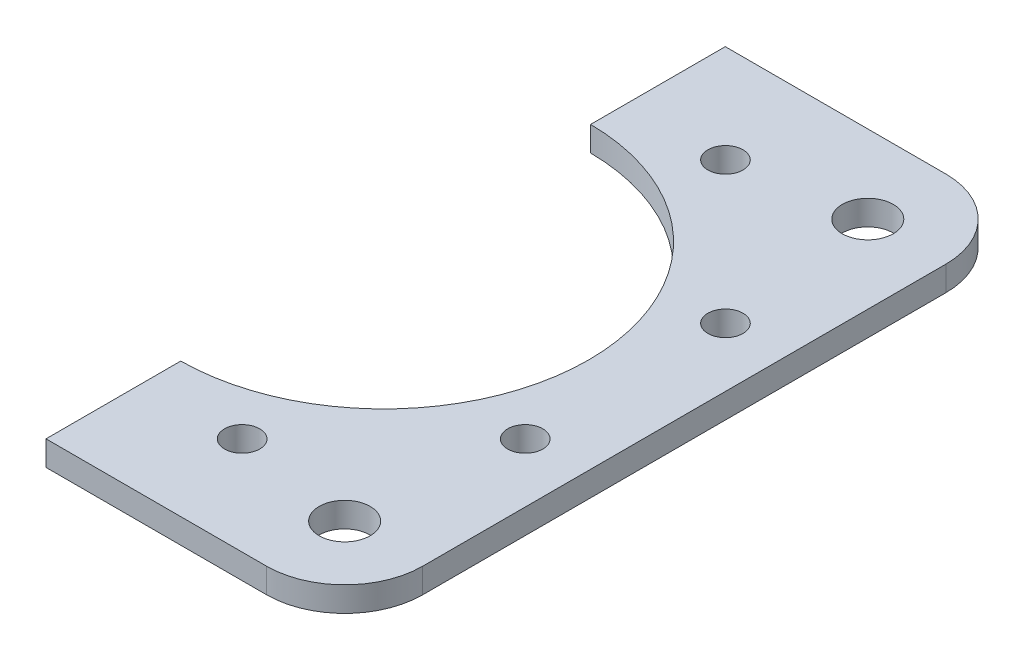
ISO-10303-21;
HEADER;
FILE_DESCRIPTION(('STEP AP214'),'2;1');
FILE_NAME('part.step','',(''),(''),'','','');
FILE_SCHEMA(('AUTOMOTIVE_DESIGN { 1 0 10303 214 1 1 1 1 }'));
ENDSEC;
DATA;
#1=APPLICATION_CONTEXT('core data for automotive mechanical design processes');
#2=APPLICATION_PROTOCOL_DEFINITION('international standard','automotive_design',2000,#1);
#3=PRODUCT_CONTEXT('',#1,'mechanical');
#4=PRODUCT('Part','Part','',(#3));
#5=PRODUCT_RELATED_PRODUCT_CATEGORY('part','',(#4));
#6=PRODUCT_DEFINITION_FORMATION('','',#4);
#7=PRODUCT_DEFINITION_CONTEXT('part definition',#1,'design');
#8=PRODUCT_DEFINITION('design','',#6,#7);
#9=PRODUCT_DEFINITION_SHAPE('','',#8);
#10=(LENGTH_UNIT() NAMED_UNIT(*) SI_UNIT(.MILLI.,.METRE.));
#11=(NAMED_UNIT(*) PLANE_ANGLE_UNIT() SI_UNIT($,.RADIAN.));
#12=(NAMED_UNIT(*) SI_UNIT($,.STERADIAN.) SOLID_ANGLE_UNIT());
#13=UNCERTAINTY_MEASURE_WITH_UNIT(LENGTH_MEASURE(1.E-05),#10,'distance_accuracy_value','');
#14=(GEOMETRIC_REPRESENTATION_CONTEXT(3) GLOBAL_UNCERTAINTY_ASSIGNED_CONTEXT((#13)) GLOBAL_UNIT_ASSIGNED_CONTEXT((#10,
#11,#12)) REPRESENTATION_CONTEXT('',''));
#15=CARTESIAN_POINT('',(0.,0.,0.));
#16=DIRECTION('',(0.,0.,1.));
#17=DIRECTION('',(1.,0.,0.));
#18=AXIS2_PLACEMENT_3D('',#15,#16,#17);
#19=CARTESIAN_POINT('',(0.,84.005,0.));
#20=DIRECTION('',(0.,1.,0.));
#21=DIRECTION('',(0.,0.,1.));
#22=AXIS2_PLACEMENT_3D('',#19,#20,#21);
#23=CYLINDRICAL_SURFACE('',#22,26.25);
#24=CARTESIAN_POINT('',(0.,87.18,0.));
#25=DIRECTION('',(0.,1.,0.));
#26=DIRECTION('',(0.,0.,1.));
#27=AXIS2_PLACEMENT_3D('',#24,#25,#26);
#28=CIRCLE('',#27,26.25);
#29=CARTESIAN_POINT('',(0.250000000000008,87.18,26.2488094968134));
#30=VERTEX_POINT('',#29);
#31=CARTESIAN_POINT('',(0.250000000000008,87.18,-26.2488094968134));
#32=VERTEX_POINT('',#31);
#33=EDGE_CURVE('E154',#30,#32,#28,.T.);
#34=ORIENTED_EDGE('',*,*,#33,.T.);
#35=DIRECTION('',(0.,1.,0.));
#36=VECTOR('',#35,1.);
#37=CARTESIAN_POINT('',(0.250000000000008,84.005,-26.2488094968134));
#38=LINE('',#37,#36);
#39=CARTESIAN_POINT('',(0.250000000000008,84.005,-26.2488094968134));
#40=VERTEX_POINT('',#39);
#41=EDGE_CURVE('E11',#40,#32,#38,.T.);
#42=ORIENTED_EDGE('',*,*,#41,.F.);
#43=CARTESIAN_POINT('',(0.,84.005,0.));
#44=DIRECTION('',(0.,1.,0.));
#45=DIRECTION('',(0.,0.,1.));
#46=AXIS2_PLACEMENT_3D('',#43,#44,#45);
#47=CIRCLE('',#46,26.25);
#48=CARTESIAN_POINT('',(0.250000000000008,84.005,26.2488094968134));
#49=VERTEX_POINT('',#48);
#50=EDGE_CURVE('E57',#49,#40,#47,.T.);
#51=ORIENTED_EDGE('',*,*,#50,.F.);
#52=DIRECTION('',(0.,1.,0.));
#53=VECTOR('',#52,1.);
#54=CARTESIAN_POINT('',(0.250000000000008,84.005,26.2488094968134));
#55=LINE('',#54,#53);
#56=EDGE_CURVE('E42',#49,#30,#55,.T.);
#57=ORIENTED_EDGE('',*,*,#56,.T.);
#58=EDGE_LOOP('',(#34,#42,#51,#57));
#59=FACE_BOUND('',#58,.T.);
#60=ADVANCED_FACE('F39',(#59),#23,.F.);
#61=CARTESIAN_POINT('',(0.250000000000008,84.005,0.));
#62=DIRECTION('',(-1.,0.,0.));
#63=DIRECTION('',(0.,0.,1.));
#64=AXIS2_PLACEMENT_3D('',#61,#62,#63);
#65=PLANE('',#64);
#66=DIRECTION('',(0.,0.,1.));
#67=VECTOR('',#66,1.);
#68=CARTESIAN_POINT('',(0.250000000000008,87.18,0.));
#69=LINE('',#68,#67);
#70=CARTESIAN_POINT('',(0.250000000000008,87.18,-43.4991883031318));
#71=VERTEX_POINT('',#70);
#72=EDGE_CURVE('E170',#71,#32,#69,.T.);
#73=ORIENTED_EDGE('',*,*,#72,.F.);
#74=DIRECTION('',(0.,1.,0.));
#75=VECTOR('',#74,1.);
#76=CARTESIAN_POINT('',(0.250000000000008,84.005,-43.4991883031318));
#77=LINE('',#76,#75);
#78=CARTESIAN_POINT('',(0.250000000000008,84.005,-43.4991883031318));
#79=VERTEX_POINT('',#78);
#80=EDGE_CURVE('E48',#79,#71,#77,.T.);
#81=ORIENTED_EDGE('',*,*,#80,.F.);
#82=DIRECTION('',(0.,0.,1.));
#83=VECTOR('',#82,1.);
#84=CARTESIAN_POINT('',(0.250000000000008,84.005,0.));
#85=LINE('',#84,#83);
#86=EDGE_CURVE('E116',#79,#40,#85,.T.);
#87=ORIENTED_EDGE('',*,*,#86,.T.);
#88=ORIENTED_EDGE('',*,*,#41,.T.);
#89=EDGE_LOOP('',(#73,#81,#87,#88));
#90=FACE_BOUND('',#89,.T.);
#91=ADVANCED_FACE('F206',(#90),#65,.T.);
#92=CARTESIAN_POINT('',(0.,84.005,-43.4991883031318));
#93=DIRECTION('',(0.,0.,1.));
#94=DIRECTION('',(1.,0.,0.));
#95=AXIS2_PLACEMENT_3D('',#92,#93,#94);
#96=PLANE('',#95);
#97=DIRECTION('',(1.,0.,0.));
#98=VECTOR('',#97,1.);
#99=CARTESIAN_POINT('',(0.,87.18,-43.4991883031318));
#100=LINE('',#99,#98);
#101=CARTESIAN_POINT('',(28.4999999999999,87.18,-43.4991883031318));
#102=VERTEX_POINT('',#101);
#103=EDGE_CURVE('E121',#71,#102,#100,.T.);
#104=ORIENTED_EDGE('',*,*,#103,.T.);
#105=DIRECTION('',(0.,1.,0.));
#106=VECTOR('',#105,1.);
#107=CARTESIAN_POINT('',(28.4999999999999,84.005,-43.4991883031318));
#108=LINE('',#107,#106);
#109=CARTESIAN_POINT('',(28.4999999999999,84.005,-43.4991883031318));
#110=VERTEX_POINT('',#109);
#111=EDGE_CURVE('E119',#110,#102,#108,.T.);
#112=ORIENTED_EDGE('',*,*,#111,.F.);
#113=DIRECTION('',(1.,0.,0.));
#114=VECTOR('',#113,1.);
#115=CARTESIAN_POINT('',(0.,84.005,-43.4991883031318));
#116=LINE('',#115,#114);
#117=EDGE_CURVE('E109',#79,#110,#116,.T.);
#118=ORIENTED_EDGE('',*,*,#117,.F.);
#119=ORIENTED_EDGE('',*,*,#80,.T.);
#120=EDGE_LOOP('',(#104,#112,#118,#119));
#121=FACE_BOUND('',#120,.T.);
#122=ADVANCED_FACE('F120',(#121),#96,.F.);
#123=CARTESIAN_POINT('',(28.5,84.005,-33.4991883031318));
#124=DIRECTION('',(0.,1.,0.));
#125=DIRECTION('',(0.,0.,1.));
#126=AXIS2_PLACEMENT_3D('',#123,#124,#125);
#127=CYLINDRICAL_SURFACE('',#126,10.);
#128=CARTESIAN_POINT('',(28.5,87.18,-33.4991883031318));
#129=DIRECTION('',(0.,1.,0.));
#130=DIRECTION('',(0.,0.,1.));
#131=AXIS2_PLACEMENT_3D('',#128,#129,#130);
#132=CIRCLE('',#131,10.);
#133=CARTESIAN_POINT('',(38.5,87.18,-33.4991883031317));
#134=VERTEX_POINT('',#133);
#135=EDGE_CURVE('E167',#102,#134,#132,.F.);
#136=ORIENTED_EDGE('',*,*,#135,.T.);
#137=DIRECTION('',(0.,1.,0.));
#138=VECTOR('',#137,1.);
#139=CARTESIAN_POINT('',(38.5,84.005,-33.4991883031317));
#140=LINE('',#139,#138);
#141=CARTESIAN_POINT('',(38.5,84.005,-33.4991883031317));
#142=VERTEX_POINT('',#141);
#143=EDGE_CURVE('E124',#142,#134,#140,.T.);
#144=ORIENTED_EDGE('',*,*,#143,.F.);
#145=CARTESIAN_POINT('',(28.5,84.005,-33.4991883031318));
#146=DIRECTION('',(0.,1.,0.));
#147=DIRECTION('',(0.,0.,1.));
#148=AXIS2_PLACEMENT_3D('',#145,#146,#147);
#149=CIRCLE('',#148,10.);
#150=EDGE_CURVE('E114',#110,#142,#149,.F.);
#151=ORIENTED_EDGE('',*,*,#150,.F.);
#152=ORIENTED_EDGE('',*,*,#111,.T.);
#153=EDGE_LOOP('',(#136,#144,#151,#152));
#154=FACE_BOUND('',#153,.T.);
#155=ADVANCED_FACE('F126',(#154),#127,.T.);
#156=CARTESIAN_POINT('',(38.5,84.005,0.));
#157=DIRECTION('',(-1.,0.,0.));
#158=DIRECTION('',(0.,0.,1.));
#159=AXIS2_PLACEMENT_3D('',#156,#157,#158);
#160=PLANE('',#159);
#161=DIRECTION('',(0.,0.,1.));
#162=VECTOR('',#161,1.);
#163=CARTESIAN_POINT('',(38.5,87.18,0.));
#164=LINE('',#163,#162);
#165=CARTESIAN_POINT('',(38.5,87.18,33.4991883031317));
#166=VERTEX_POINT('',#165);
#167=EDGE_CURVE('E164',#134,#166,#164,.T.);
#168=ORIENTED_EDGE('',*,*,#167,.T.);
#169=DIRECTION('',(0.,1.,0.));
#170=VECTOR('',#169,1.);
#171=CARTESIAN_POINT('',(38.5,84.005,33.4991883031317));
#172=LINE('',#171,#170);
#173=CARTESIAN_POINT('',(38.5,84.005,33.4991883031317));
#174=VERTEX_POINT('',#173);
#175=EDGE_CURVE('E193',#174,#166,#172,.T.);
#176=ORIENTED_EDGE('',*,*,#175,.F.);
#177=DIRECTION('',(0.,0.,1.));
#178=VECTOR('',#177,1.);
#179=CARTESIAN_POINT('',(38.5,84.005,0.));
#180=LINE('',#179,#178);
#181=EDGE_CURVE('E129',#142,#174,#180,.T.);
#182=ORIENTED_EDGE('',*,*,#181,.F.);
#183=ORIENTED_EDGE('',*,*,#143,.T.);
#184=EDGE_LOOP('',(#168,#176,#182,#183));
#185=FACE_BOUND('',#184,.T.);
#186=ADVANCED_FACE('F220',(#185),#160,.F.);
#187=CARTESIAN_POINT('',(28.5,84.005,33.4991883031318));
#188=DIRECTION('',(0.,1.,0.));
#189=DIRECTION('',(0.,0.,1.));
#190=AXIS2_PLACEMENT_3D('',#187,#188,#189);
#191=CYLINDRICAL_SURFACE('',#190,10.);
#192=CARTESIAN_POINT('',(28.5,87.18,33.4991883031318));
#193=DIRECTION('',(0.,1.,0.));
#194=DIRECTION('',(0.,0.,1.));
#195=AXIS2_PLACEMENT_3D('',#192,#193,#194);
#196=CIRCLE('',#195,10.);
#197=CARTESIAN_POINT('',(28.4999999999999,87.18,43.4991883031318));
#198=VERTEX_POINT('',#197);
#199=EDGE_CURVE('E161',#198,#166,#196,.T.);
#200=ORIENTED_EDGE('',*,*,#199,.F.);
#201=DIRECTION('',(0.,1.,0.));
#202=VECTOR('',#201,1.);
#203=CARTESIAN_POINT('',(28.4999999999999,84.005,43.4991883031318));
#204=LINE('',#203,#202);
#205=CARTESIAN_POINT('',(28.4999999999999,84.005,43.4991883031318));
#206=VERTEX_POINT('',#205);
#207=EDGE_CURVE('E195',#206,#198,#204,.T.);
#208=ORIENTED_EDGE('',*,*,#207,.F.);
#209=CARTESIAN_POINT('',(28.5,84.005,33.4991883031318));
#210=DIRECTION('',(0.,1.,0.));
#211=DIRECTION('',(0.,0.,1.));
#212=AXIS2_PLACEMENT_3D('',#209,#210,#211);
#213=CIRCLE('',#212,10.);
#214=EDGE_CURVE('E131',#206,#174,#213,.T.);
#215=ORIENTED_EDGE('',*,*,#214,.T.);
#216=ORIENTED_EDGE('',*,*,#175,.T.);
#217=EDGE_LOOP('',(#200,#208,#215,#216));
#218=FACE_BOUND('',#217,.T.);
#219=ADVANCED_FACE('F223',(#218),#191,.T.);
#220=CARTESIAN_POINT('',(0.,84.005,43.4991883031318));
#221=DIRECTION('',(0.,0.,1.));
#222=DIRECTION('',(1.,0.,0.));
#223=AXIS2_PLACEMENT_3D('',#220,#221,#222);
#224=PLANE('',#223);
#225=DIRECTION('',(1.,0.,0.));
#226=VECTOR('',#225,1.);
#227=CARTESIAN_POINT('',(0.,87.18,43.4991883031318));
#228=LINE('',#227,#226);
#229=CARTESIAN_POINT('',(0.250000000000008,87.18,43.4991883031318));
#230=VERTEX_POINT('',#229);
#231=EDGE_CURVE('E158',#230,#198,#228,.T.);
#232=ORIENTED_EDGE('',*,*,#231,.F.);
#233=DIRECTION('',(0.,1.,0.));
#234=VECTOR('',#233,1.);
#235=CARTESIAN_POINT('',(0.250000000000008,84.005,43.4991883031318));
#236=LINE('',#235,#234);
#237=CARTESIAN_POINT('',(0.250000000000008,84.005,43.4991883031318));
#238=VERTEX_POINT('',#237);
#239=EDGE_CURVE('E196',#238,#230,#236,.T.);
#240=ORIENTED_EDGE('',*,*,#239,.F.);
#241=DIRECTION('',(1.,0.,0.));
#242=VECTOR('',#241,1.);
#243=CARTESIAN_POINT('',(0.,84.005,43.4991883031318));
#244=LINE('',#243,#242);
#245=EDGE_CURVE('E436',#238,#206,#244,.T.);
#246=ORIENTED_EDGE('',*,*,#245,.T.);
#247=ORIENTED_EDGE('',*,*,#207,.T.);
#248=EDGE_LOOP('',(#232,#240,#246,#247));
#249=FACE_BOUND('',#248,.T.);
#250=ADVANCED_FACE('F227',(#249),#224,.T.);
#251=CARTESIAN_POINT('',(28.5,84.005,-33.4991883031318));
#252=DIRECTION('',(0.,1.,0.));
#253=DIRECTION('',(0.,0.,1.));
#254=AXIS2_PLACEMENT_3D('',#251,#252,#253);
#255=CYLINDRICAL_SURFACE('',#254,3.26390000000001);
#256=CARTESIAN_POINT('',(28.5,84.005,-33.4991883031318));
#257=DIRECTION('',(0.,1.,0.));
#258=DIRECTION('',(0.,0.,1.));
#259=AXIS2_PLACEMENT_3D('',#256,#257,#258);
#260=CIRCLE('',#259,3.26390000000001);
#261=CARTESIAN_POINT('',(28.5,84.005,-30.2352883031318));
#262=VERTEX_POINT('',#261);
#263=EDGE_CURVE('E148',#262,#262,#260,.T.);
#264=ORIENTED_EDGE('',*,*,#263,.F.);
#265=EDGE_LOOP('',(#264));
#266=FACE_BOUND('',#265,.T.);
#267=CARTESIAN_POINT('',(28.5,87.18,-33.4991883031318));
#268=DIRECTION('',(0.,1.,0.));
#269=DIRECTION('',(0.,0.,1.));
#270=AXIS2_PLACEMENT_3D('',#267,#268,#269);
#271=CIRCLE('',#270,3.26390000000001);
#272=CARTESIAN_POINT('',(28.5,87.18,-30.2352883031318));
#273=VERTEX_POINT('',#272);
#274=EDGE_CURVE('E185',#273,#273,#271,.T.);
#275=ORIENTED_EDGE('',*,*,#274,.T.);
#276=EDGE_LOOP('',(#275));
#277=FACE_BOUND('',#276,.T.);
#278=ADVANCED_FACE('F230',(#266,#277),#255,.F.);
#279=CARTESIAN_POINT('',(12.8198949842307,84.005,30.949964339128));
#280=DIRECTION('',(0.,1.,0.));
#281=DIRECTION('',(0.,0.,1.));
#282=AXIS2_PLACEMENT_3D('',#279,#280,#281);
#283=CYLINDRICAL_SURFACE('',#282,2.25);
#284=CARTESIAN_POINT('',(12.8198949842307,84.005,30.949964339128));
#285=DIRECTION('',(0.,1.,0.));
#286=DIRECTION('',(0.,0.,1.));
#287=AXIS2_PLACEMENT_3D('',#284,#285,#286);
#288=CIRCLE('',#287,2.25);
#289=CARTESIAN_POINT('',(12.8198949842307,84.005,33.199964339128));
#290=VERTEX_POINT('',#289);
#291=EDGE_CURVE('E145',#290,#290,#288,.T.);
#292=ORIENTED_EDGE('',*,*,#291,.F.);
#293=EDGE_LOOP('',(#292));
#294=FACE_BOUND('',#293,.T.);
#295=CARTESIAN_POINT('',(12.8198949842307,87.18,30.949964339128));
#296=DIRECTION('',(0.,1.,0.));
#297=DIRECTION('',(0.,0.,1.));
#298=AXIS2_PLACEMENT_3D('',#295,#296,#297);
#299=CIRCLE('',#298,2.25);
#300=CARTESIAN_POINT('',(12.8198949842307,87.18,33.199964339128));
#301=VERTEX_POINT('',#300);
#302=EDGE_CURVE('E182',#301,#301,#299,.T.);
#303=ORIENTED_EDGE('',*,*,#302,.T.);
#304=EDGE_LOOP('',(#303));
#305=FACE_BOUND('',#304,.T.);
#306=ADVANCED_FACE('F266',(#294,#305),#283,.F.);
#307=CARTESIAN_POINT('',(30.9499643391282,84.005,12.8198949842303));
#308=DIRECTION('',(0.,1.,0.));
#309=DIRECTION('',(0.,0.,1.));
#310=AXIS2_PLACEMENT_3D('',#307,#308,#309);
#311=CYLINDRICAL_SURFACE('',#310,2.25);
#312=CARTESIAN_POINT('',(30.9499643391282,84.005,12.8198949842303));
#313=DIRECTION('',(0.,1.,0.));
#314=DIRECTION('',(0.,0.,1.));
#315=AXIS2_PLACEMENT_3D('',#312,#313,#314);
#316=CIRCLE('',#315,2.25);
#317=CARTESIAN_POINT('',(30.9499643391282,84.005,15.0698949842303));
#318=VERTEX_POINT('',#317);
#319=EDGE_CURVE('E142',#318,#318,#316,.T.);
#320=ORIENTED_EDGE('',*,*,#319,.F.);
#321=EDGE_LOOP('',(#320));
#322=FACE_BOUND('',#321,.T.);
#323=CARTESIAN_POINT('',(30.9499643391282,87.18,12.8198949842303));
#324=DIRECTION('',(0.,1.,0.));
#325=DIRECTION('',(0.,0.,1.));
#326=AXIS2_PLACEMENT_3D('',#323,#324,#325);
#327=CIRCLE('',#326,2.25);
#328=CARTESIAN_POINT('',(30.9499643391282,87.18,15.0698949842303));
#329=VERTEX_POINT('',#328);
#330=EDGE_CURVE('E179',#329,#329,#327,.T.);
#331=ORIENTED_EDGE('',*,*,#330,.T.);
#332=EDGE_LOOP('',(#331));
#333=FACE_BOUND('',#332,.T.);
#334=ADVANCED_FACE('F246',(#322,#333),#311,.F.);
#335=CARTESIAN_POINT('',(30.9499643391281,84.005,-12.8198949842307));
#336=DIRECTION('',(0.,1.,0.));
#337=DIRECTION('',(0.,0.,1.));
#338=AXIS2_PLACEMENT_3D('',#335,#336,#337);
#339=CYLINDRICAL_SURFACE('',#338,2.25);
#340=CARTESIAN_POINT('',(30.9499643391281,84.005,-12.8198949842307));
#341=DIRECTION('',(0.,1.,0.));
#342=DIRECTION('',(0.,0.,1.));
#343=AXIS2_PLACEMENT_3D('',#340,#341,#342);
#344=CIRCLE('',#343,2.25);
#345=CARTESIAN_POINT('',(30.9499643391281,84.005,-10.5698949842307));
#346=VERTEX_POINT('',#345);
#347=EDGE_CURVE('E139',#346,#346,#344,.T.);
#348=ORIENTED_EDGE('',*,*,#347,.F.);
#349=EDGE_LOOP('',(#348));
#350=FACE_BOUND('',#349,.T.);
#351=CARTESIAN_POINT('',(30.9499643391281,87.18,-12.8198949842307));
#352=DIRECTION('',(0.,1.,0.));
#353=DIRECTION('',(0.,0.,1.));
#354=AXIS2_PLACEMENT_3D('',#351,#352,#353);
#355=CIRCLE('',#354,2.25);
#356=CARTESIAN_POINT('',(30.9499643391281,87.18,-10.5698949842307));
#357=VERTEX_POINT('',#356);
#358=EDGE_CURVE('E176',#357,#357,#355,.T.);
#359=ORIENTED_EDGE('',*,*,#358,.T.);
#360=EDGE_LOOP('',(#359));
#361=FACE_BOUND('',#360,.T.);
#362=ADVANCED_FACE('F241',(#350,#361),#339,.F.);
#363=CARTESIAN_POINT('',(12.8198949842303,84.005,-30.9499643391282));
#364=DIRECTION('',(0.,1.,0.));
#365=DIRECTION('',(0.,0.,1.));
#366=AXIS2_PLACEMENT_3D('',#363,#364,#365);
#367=CYLINDRICAL_SURFACE('',#366,2.25);
#368=CARTESIAN_POINT('',(12.8198949842303,84.005,-30.9499643391282));
#369=DIRECTION('',(0.,1.,0.));
#370=DIRECTION('',(0.,0.,1.));
#371=AXIS2_PLACEMENT_3D('',#368,#369,#370);
#372=CIRCLE('',#371,2.25);
#373=CARTESIAN_POINT('',(12.8198949842303,84.005,-28.6999643391282));
#374=VERTEX_POINT('',#373);
#375=EDGE_CURVE('E136',#374,#374,#372,.T.);
#376=ORIENTED_EDGE('',*,*,#375,.F.);
#377=EDGE_LOOP('',(#376));
#378=FACE_BOUND('',#377,.T.);
#379=CARTESIAN_POINT('',(12.8198949842303,87.18,-30.9499643391282));
#380=DIRECTION('',(0.,1.,0.));
#381=DIRECTION('',(0.,0.,1.));
#382=AXIS2_PLACEMENT_3D('',#379,#380,#381);
#383=CIRCLE('',#382,2.25);
#384=CARTESIAN_POINT('',(12.8198949842303,87.18,-28.6999643391282));
#385=VERTEX_POINT('',#384);
#386=EDGE_CURVE('E173',#385,#385,#383,.T.);
#387=ORIENTED_EDGE('',*,*,#386,.T.);
#388=EDGE_LOOP('',(#387));
#389=FACE_BOUND('',#388,.T.);
#390=ADVANCED_FACE('F215',(#378,#389),#367,.F.);
#391=CARTESIAN_POINT('',(0.250000000000008,84.005,0.));
#392=DIRECTION('',(1.,0.,0.));
#393=DIRECTION('',(0.,0.,-1.));
#394=AXIS2_PLACEMENT_3D('',#391,#392,#393);
#395=PLANE('',#394);
#396=DIRECTION('',(0.,0.,-1.));
#397=VECTOR('',#396,1.);
#398=CARTESIAN_POINT('',(0.250000000000008,87.18,0.));
#399=LINE('',#398,#397);
#400=EDGE_CURVE('E156',#230,#30,#399,.T.);
#401=ORIENTED_EDGE('',*,*,#400,.T.);
#402=ORIENTED_EDGE('',*,*,#56,.F.);
#403=DIRECTION('',(0.,0.,-1.));
#404=VECTOR('',#403,1.);
#405=CARTESIAN_POINT('',(0.250000000000008,84.005,0.));
#406=LINE('',#405,#404);
#407=EDGE_CURVE('E95',#238,#49,#406,.T.);
#408=ORIENTED_EDGE('',*,*,#407,.F.);
#409=ORIENTED_EDGE('',*,*,#239,.T.);
#410=EDGE_LOOP('',(#401,#402,#408,#409));
#411=FACE_BOUND('',#410,.T.);
#412=ADVANCED_FACE('F232',(#411),#395,.F.);
#413=CARTESIAN_POINT('',(28.5,84.005,33.4991883031318));
#414=DIRECTION('',(0.,1.,0.));
#415=DIRECTION('',(0.,0.,1.));
#416=AXIS2_PLACEMENT_3D('',#413,#414,#415);
#417=CYLINDRICAL_SURFACE('',#416,3.26390000000001);
#418=CARTESIAN_POINT('',(28.5,84.005,33.4991883031318));
#419=DIRECTION('',(0.,1.,0.));
#420=DIRECTION('',(0.,0.,1.));
#421=AXIS2_PLACEMENT_3D('',#418,#419,#420);
#422=CIRCLE('',#421,3.26390000000001);
#423=CARTESIAN_POINT('',(28.5,84.005,36.7630883031318));
#424=VERTEX_POINT('',#423);
#425=EDGE_CURVE('E151',#424,#424,#422,.T.);
#426=ORIENTED_EDGE('',*,*,#425,.F.);
#427=EDGE_LOOP('',(#426));
#428=FACE_BOUND('',#427,.T.);
#429=CARTESIAN_POINT('',(28.5,87.18,33.4991883031318));
#430=DIRECTION('',(0.,1.,0.));
#431=DIRECTION('',(0.,0.,1.));
#432=AXIS2_PLACEMENT_3D('',#429,#430,#431);
#433=CIRCLE('',#432,3.26390000000001);
#434=CARTESIAN_POINT('',(28.5,87.18,36.7630883031318));
#435=VERTEX_POINT('',#434);
#436=EDGE_CURVE('E188',#435,#435,#433,.T.);
#437=ORIENTED_EDGE('',*,*,#436,.T.);
#438=EDGE_LOOP('',(#437));
#439=FACE_BOUND('',#438,.T.);
#440=ADVANCED_FACE('F234',(#428,#439),#417,.F.);
#441=CARTESIAN_POINT('',(0.,84.005,0.));
#442=DIRECTION('',(0.,1.,0.));
#443=DIRECTION('',(0.,0.,1.));
#444=AXIS2_PLACEMENT_3D('',#441,#442,#443);
#445=PLANE('',#444);
#446=ORIENTED_EDGE('',*,*,#50,.T.);
#447=ORIENTED_EDGE('',*,*,#86,.F.);
#448=ORIENTED_EDGE('',*,*,#117,.T.);
#449=ORIENTED_EDGE('',*,*,#150,.T.);
#450=ORIENTED_EDGE('',*,*,#181,.T.);
#451=ORIENTED_EDGE('',*,*,#214,.F.);
#452=ORIENTED_EDGE('',*,*,#245,.F.);
#453=ORIENTED_EDGE('',*,*,#407,.T.);
#454=EDGE_LOOP('',(#446,#447,#448,#449,#450,#451,#452,#453));
#455=FACE_BOUND('',#454,.T.);
#456=ORIENTED_EDGE('',*,*,#375,.T.);
#457=EDGE_LOOP('',(#456));
#458=FACE_BOUND('',#457,.T.);
#459=ORIENTED_EDGE('',*,*,#347,.T.);
#460=EDGE_LOOP('',(#459));
#461=FACE_BOUND('',#460,.T.);
#462=ORIENTED_EDGE('',*,*,#319,.T.);
#463=EDGE_LOOP('',(#462));
#464=FACE_BOUND('',#463,.T.);
#465=ORIENTED_EDGE('',*,*,#291,.T.);
#466=EDGE_LOOP('',(#465));
#467=FACE_BOUND('',#466,.T.);
#468=ORIENTED_EDGE('',*,*,#263,.T.);
#469=EDGE_LOOP('',(#468));
#470=FACE_BOUND('',#469,.T.);
#471=ORIENTED_EDGE('',*,*,#425,.T.);
#472=EDGE_LOOP('',(#471));
#473=FACE_BOUND('',#472,.T.);
#474=ADVANCED_FACE('F111',(#455,#458,#461,#464,#467,#470,#473),#445,.F.);
#475=CARTESIAN_POINT('',(0.,87.18,0.));
#476=DIRECTION('',(0.,1.,0.));
#477=DIRECTION('',(0.,0.,1.));
#478=AXIS2_PLACEMENT_3D('',#475,#476,#477);
#479=PLANE('',#478);
#480=ORIENTED_EDGE('',*,*,#33,.F.);
#481=ORIENTED_EDGE('',*,*,#400,.F.);
#482=ORIENTED_EDGE('',*,*,#231,.T.);
#483=ORIENTED_EDGE('',*,*,#199,.T.);
#484=ORIENTED_EDGE('',*,*,#167,.F.);
#485=ORIENTED_EDGE('',*,*,#135,.F.);
#486=ORIENTED_EDGE('',*,*,#103,.F.);
#487=ORIENTED_EDGE('',*,*,#72,.T.);
#488=EDGE_LOOP('',(#480,#481,#482,#483,#484,#485,#486,#487));
#489=FACE_BOUND('',#488,.T.);
#490=ORIENTED_EDGE('',*,*,#386,.F.);
#491=EDGE_LOOP('',(#490));
#492=FACE_BOUND('',#491,.T.);
#493=ORIENTED_EDGE('',*,*,#358,.F.);
#494=EDGE_LOOP('',(#493));
#495=FACE_BOUND('',#494,.T.);
#496=ORIENTED_EDGE('',*,*,#330,.F.);
#497=EDGE_LOOP('',(#496));
#498=FACE_BOUND('',#497,.T.);
#499=ORIENTED_EDGE('',*,*,#302,.F.);
#500=EDGE_LOOP('',(#499));
#501=FACE_BOUND('',#500,.T.);
#502=ORIENTED_EDGE('',*,*,#274,.F.);
#503=EDGE_LOOP('',(#502));
#504=FACE_BOUND('',#503,.T.);
#505=ORIENTED_EDGE('',*,*,#436,.F.);
#506=EDGE_LOOP('',(#505));
#507=FACE_BOUND('',#506,.T.);
#508=ADVANCED_FACE('F203',(#489,#492,#495,#498,#501,#504,#507),#479,.T.);
#509=CLOSED_SHELL('',(#60,#91,#122,#155,#186,#219,#250,#278,#306,#334,#362,#390,#412,#440,#474,#508));
#510=MANIFOLD_SOLID_BREP('B2',#509);
#511=ADVANCED_BREP_SHAPE_REPRESENTATION('',(#18,#510),#14);
#512=SHAPE_DEFINITION_REPRESENTATION(#9,#511);
ENDSEC;
END-ISO-10303-21;
